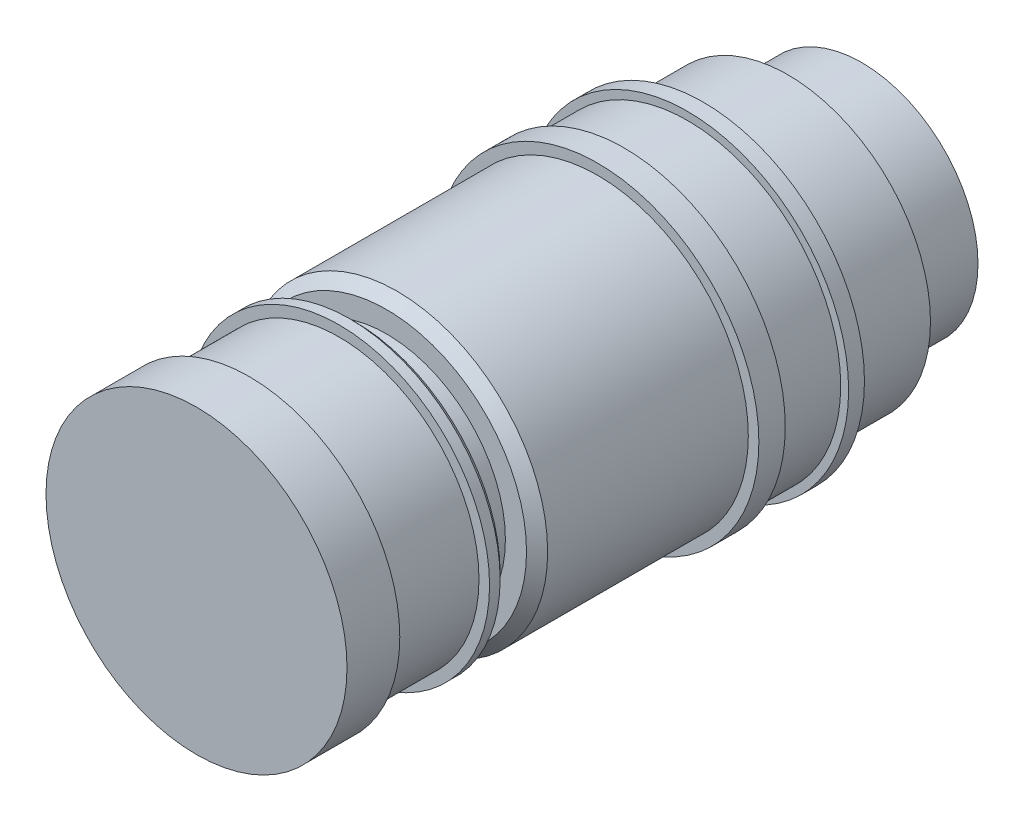
ISO-10303-21;
HEADER;
FILE_DESCRIPTION(('STEP AP214'),'2;1');
FILE_NAME('part.step','',(''),(''),'','','');
FILE_SCHEMA(('AUTOMOTIVE_DESIGN { 1 0 10303 214 1 1 1 1 }'));
ENDSEC;
DATA;
#1=APPLICATION_CONTEXT('core data for automotive mechanical design processes');
#2=APPLICATION_PROTOCOL_DEFINITION('international standard','automotive_design',2000,#1);
#3=PRODUCT_CONTEXT('',#1,'mechanical');
#4=PRODUCT('Part','Part','',(#3));
#5=PRODUCT_RELATED_PRODUCT_CATEGORY('part','',(#4));
#6=PRODUCT_DEFINITION_FORMATION('','',#4);
#7=PRODUCT_DEFINITION_CONTEXT('part definition',#1,'design');
#8=PRODUCT_DEFINITION('design','',#6,#7);
#9=PRODUCT_DEFINITION_SHAPE('','',#8);
#10=(LENGTH_UNIT() NAMED_UNIT(*) SI_UNIT(.MILLI.,.METRE.));
#11=(NAMED_UNIT(*) PLANE_ANGLE_UNIT() SI_UNIT($,.RADIAN.));
#12=(NAMED_UNIT(*) SI_UNIT($,.STERADIAN.) SOLID_ANGLE_UNIT());
#13=UNCERTAINTY_MEASURE_WITH_UNIT(LENGTH_MEASURE(1.E-05),#10,'distance_accuracy_value','');
#14=(GEOMETRIC_REPRESENTATION_CONTEXT(3) GLOBAL_UNCERTAINTY_ASSIGNED_CONTEXT((#13)) GLOBAL_UNIT_ASSIGNED_CONTEXT((#10,
#11,#12)) REPRESENTATION_CONTEXT('',''));
#15=CARTESIAN_POINT('',(0.,0.,0.));
#16=DIRECTION('',(0.,0.,1.));
#17=DIRECTION('',(1.,0.,0.));
#18=AXIS2_PLACEMENT_3D('',#15,#16,#17);
#19=CARTESIAN_POINT('',(0.,0.,-63.));
#20=DIRECTION('',(0.,0.,1.));
#21=DIRECTION('',(1.,0.,0.));
#22=AXIS2_PLACEMENT_3D('',#19,#20,#21);
#23=PLANE('',#22);
#24=CARTESIAN_POINT('',(0.,0.,-63.));
#25=DIRECTION('',(0.,0.,1.));
#26=DIRECTION('',(1.,0.,0.));
#27=AXIS2_PLACEMENT_3D('',#24,#25,#26);
#28=CIRCLE('',#27,11.);
#29=CARTESIAN_POINT('',(11.,0.,-63.));
#30=VERTEX_POINT('',#29);
#31=EDGE_CURVE('E55',#30,#30,#28,.T.);
#32=ORIENTED_EDGE('',*,*,#31,.F.);
#33=EDGE_LOOP('',(#32));
#34=FACE_BOUND('',#33,.T.);
#35=ADVANCED_FACE('F35',(#34),#23,.F.);
#36=CARTESIAN_POINT('',(0.,0.,-5.));
#37=DIRECTION('',(0.,0.,1.));
#38=DIRECTION('',(1.,0.,0.));
#39=AXIS2_PLACEMENT_3D('',#36,#37,#38);
#40=CYLINDRICAL_SURFACE('',#39,11.);
#41=ORIENTED_EDGE('',*,*,#31,.T.);
#42=EDGE_LOOP('',(#41));
#43=FACE_BOUND('',#42,.T.);
#44=CARTESIAN_POINT('',(0.,0.,-56.));
#45=DIRECTION('',(0.,0.,1.));
#46=DIRECTION('',(1.,0.,0.));
#47=AXIS2_PLACEMENT_3D('',#44,#45,#46);
#48=CIRCLE('',#47,11.);
#49=CARTESIAN_POINT('',(11.,0.,-56.));
#50=VERTEX_POINT('',#49);
#51=EDGE_CURVE('E58',#50,#50,#48,.T.);
#52=ORIENTED_EDGE('',*,*,#51,.F.);
#53=EDGE_LOOP('',(#52));
#54=FACE_BOUND('',#53,.T.);
#55=ADVANCED_FACE('F127',(#43,#54),#40,.T.);
#56=CARTESIAN_POINT('',(0.,0.,-56.));
#57=DIRECTION('',(0.,0.,1.));
#58=DIRECTION('',(1.,0.,0.));
#59=AXIS2_PLACEMENT_3D('',#56,#57,#58);
#60=PLANE('',#59);
#61=CARTESIAN_POINT('',(0.,0.,-56.));
#62=DIRECTION('',(0.,0.,1.));
#63=DIRECTION('',(1.,0.,0.));
#64=AXIS2_PLACEMENT_3D('',#61,#62,#63);
#65=CIRCLE('',#64,13.5);
#66=CARTESIAN_POINT('',(13.5,0.,-56.));
#67=VERTEX_POINT('',#66);
#68=EDGE_CURVE('E61',#67,#67,#65,.T.);
#69=ORIENTED_EDGE('',*,*,#68,.F.);
#70=EDGE_LOOP('',(#69));
#71=FACE_BOUND('',#70,.T.);
#72=ORIENTED_EDGE('',*,*,#51,.T.);
#73=EDGE_LOOP('',(#72));
#74=FACE_BOUND('',#73,.T.);
#75=ADVANCED_FACE('F133',(#71,#74),#60,.F.);
#76=CARTESIAN_POINT('',(0.,0.,-5.));
#77=DIRECTION('',(0.,0.,1.));
#78=DIRECTION('',(1.,0.,0.));
#79=AXIS2_PLACEMENT_3D('',#76,#77,#78);
#80=CYLINDRICAL_SURFACE('',#79,13.5);
#81=ORIENTED_EDGE('',*,*,#68,.T.);
#82=EDGE_LOOP('',(#81));
#83=FACE_BOUND('',#82,.T.);
#84=CARTESIAN_POINT('',(0.,0.,-48.));
#85=DIRECTION('',(0.,0.,1.));
#86=DIRECTION('',(1.,0.,0.));
#87=AXIS2_PLACEMENT_3D('',#84,#85,#86);
#88=CIRCLE('',#87,13.5);
#89=CARTESIAN_POINT('',(13.5,0.,-48.));
#90=VERTEX_POINT('',#89);
#91=EDGE_CURVE('E64',#90,#90,#88,.T.);
#92=ORIENTED_EDGE('',*,*,#91,.F.);
#93=EDGE_LOOP('',(#92));
#94=FACE_BOUND('',#93,.T.);
#95=ADVANCED_FACE('F202',(#83,#94),#80,.T.);
#96=CARTESIAN_POINT('',(0.,0.,-48.));
#97=DIRECTION('',(0.,0.,1.));
#98=DIRECTION('',(1.,0.,0.));
#99=AXIS2_PLACEMENT_3D('',#96,#97,#98);
#100=PLANE('',#99);
#101=CARTESIAN_POINT('',(0.,0.,-48.));
#102=DIRECTION('',(0.,0.,1.));
#103=DIRECTION('',(1.,0.,0.));
#104=AXIS2_PLACEMENT_3D('',#101,#102,#103);
#105=CIRCLE('',#104,15.25);
#106=CARTESIAN_POINT('',(15.25,0.,-48.));
#107=VERTEX_POINT('',#106);
#108=EDGE_CURVE('E67',#107,#107,#105,.T.);
#109=ORIENTED_EDGE('',*,*,#108,.F.);
#110=EDGE_LOOP('',(#109));
#111=FACE_BOUND('',#110,.T.);
#112=ORIENTED_EDGE('',*,*,#91,.T.);
#113=EDGE_LOOP('',(#112));
#114=FACE_BOUND('',#113,.T.);
#115=ADVANCED_FACE('F198',(#111,#114),#100,.F.);
#116=CARTESIAN_POINT('',(0.,0.,-5.));
#117=DIRECTION('',(0.,0.,1.));
#118=DIRECTION('',(1.,0.,0.));
#119=AXIS2_PLACEMENT_3D('',#116,#117,#118);
#120=CYLINDRICAL_SURFACE('',#119,15.25);
#121=ORIENTED_EDGE('',*,*,#108,.T.);
#122=EDGE_LOOP('',(#121));
#123=FACE_BOUND('',#122,.T.);
#124=CARTESIAN_POINT('',(0.,0.,-46.5));
#125=DIRECTION('',(0.,0.,1.));
#126=DIRECTION('',(1.,0.,0.));
#127=AXIS2_PLACEMENT_3D('',#124,#125,#126);
#128=CIRCLE('',#127,15.25);
#129=CARTESIAN_POINT('',(15.25,0.,-46.5));
#130=VERTEX_POINT('',#129);
#131=EDGE_CURVE('E70',#130,#130,#128,.T.);
#132=ORIENTED_EDGE('',*,*,#131,.F.);
#133=EDGE_LOOP('',(#132));
#134=FACE_BOUND('',#133,.T.);
#135=ADVANCED_FACE('F194',(#123,#134),#120,.T.);
#136=CARTESIAN_POINT('',(0.,0.,-46.5));
#137=DIRECTION('',(0.,0.,1.));
#138=DIRECTION('',(1.,0.,0.));
#139=AXIS2_PLACEMENT_3D('',#136,#137,#138);
#140=PLANE('',#139);
#141=ORIENTED_EDGE('',*,*,#131,.T.);
#142=EDGE_LOOP('',(#141));
#143=FACE_BOUND('',#142,.T.);
#144=CARTESIAN_POINT('',(0.,0.,-46.5));
#145=DIRECTION('',(0.,0.,1.));
#146=DIRECTION('',(1.,0.,0.));
#147=AXIS2_PLACEMENT_3D('',#144,#145,#146);
#148=CIRCLE('',#147,14.5);
#149=CARTESIAN_POINT('',(14.5,0.,-46.5));
#150=VERTEX_POINT('',#149);
#151=EDGE_CURVE('E73',#150,#150,#148,.T.);
#152=ORIENTED_EDGE('',*,*,#151,.F.);
#153=EDGE_LOOP('',(#152));
#154=FACE_BOUND('',#153,.T.);
#155=ADVANCED_FACE('F190',(#143,#154),#140,.T.);
#156=CARTESIAN_POINT('',(0.,0.,-5.));
#157=DIRECTION('',(0.,0.,1.));
#158=DIRECTION('',(1.,0.,0.));
#159=AXIS2_PLACEMENT_3D('',#156,#157,#158);
#160=CYLINDRICAL_SURFACE('',#159,14.5);
#161=ORIENTED_EDGE('',*,*,#151,.T.);
#162=EDGE_LOOP('',(#161));
#163=FACE_BOUND('',#162,.T.);
#164=CARTESIAN_POINT('',(0.,0.,-40.5));
#165=DIRECTION('',(0.,0.,1.));
#166=DIRECTION('',(1.,0.,0.));
#167=AXIS2_PLACEMENT_3D('',#164,#165,#166);
#168=CIRCLE('',#167,14.5);
#169=CARTESIAN_POINT('',(14.5,0.,-40.5));
#170=VERTEX_POINT('',#169);
#171=EDGE_CURVE('E76',#170,#170,#168,.T.);
#172=ORIENTED_EDGE('',*,*,#171,.F.);
#173=EDGE_LOOP('',(#172));
#174=FACE_BOUND('',#173,.T.);
#175=ADVANCED_FACE('F186',(#163,#174),#160,.T.);
#176=CARTESIAN_POINT('',(0.,0.,-40.5));
#177=DIRECTION('',(0.,0.,1.));
#178=DIRECTION('',(1.,0.,0.));
#179=AXIS2_PLACEMENT_3D('',#176,#177,#178);
#180=PLANE('',#179);
#181=CARTESIAN_POINT('',(0.,0.,-40.5));
#182=DIRECTION('',(0.,0.,1.));
#183=DIRECTION('',(1.,0.,0.));
#184=AXIS2_PLACEMENT_3D('',#181,#182,#183);
#185=CIRCLE('',#184,15.25);
#186=CARTESIAN_POINT('',(15.25,0.,-40.5));
#187=VERTEX_POINT('',#186);
#188=EDGE_CURVE('E79',#187,#187,#185,.T.);
#189=ORIENTED_EDGE('',*,*,#188,.F.);
#190=EDGE_LOOP('',(#189));
#191=FACE_BOUND('',#190,.T.);
#192=ORIENTED_EDGE('',*,*,#171,.T.);
#193=EDGE_LOOP('',(#192));
#194=FACE_BOUND('',#193,.T.);
#195=ADVANCED_FACE('F182',(#191,#194),#180,.F.);
#196=CARTESIAN_POINT('',(0.,0.,-5.));
#197=DIRECTION('',(0.,0.,1.));
#198=DIRECTION('',(1.,0.,0.));
#199=AXIS2_PLACEMENT_3D('',#196,#197,#198);
#200=CYLINDRICAL_SURFACE('',#199,15.25);
#201=ORIENTED_EDGE('',*,*,#188,.T.);
#202=EDGE_LOOP('',(#201));
#203=FACE_BOUND('',#202,.T.);
#204=CARTESIAN_POINT('',(0.,0.,-38.));
#205=DIRECTION('',(0.,0.,1.));
#206=DIRECTION('',(1.,0.,0.));
#207=AXIS2_PLACEMENT_3D('',#204,#205,#206);
#208=CIRCLE('',#207,15.25);
#209=CARTESIAN_POINT('',(15.25,0.,-38.));
#210=VERTEX_POINT('',#209);
#211=EDGE_CURVE('E82',#210,#210,#208,.T.);
#212=ORIENTED_EDGE('',*,*,#211,.F.);
#213=EDGE_LOOP('',(#212));
#214=FACE_BOUND('',#213,.T.);
#215=ADVANCED_FACE('F178',(#203,#214),#200,.T.);
#216=CARTESIAN_POINT('',(0.,0.,-38.));
#217=DIRECTION('',(0.,0.,1.));
#218=DIRECTION('',(1.,0.,0.));
#219=AXIS2_PLACEMENT_3D('',#216,#217,#218);
#220=PLANE('',#219);
#221=ORIENTED_EDGE('',*,*,#211,.T.);
#222=EDGE_LOOP('',(#221));
#223=FACE_BOUND('',#222,.T.);
#224=CARTESIAN_POINT('',(0.,0.,-38.));
#225=DIRECTION('',(0.,0.,1.));
#226=DIRECTION('',(1.,0.,0.));
#227=AXIS2_PLACEMENT_3D('',#224,#225,#226);
#228=CIRCLE('',#227,14.25);
#229=CARTESIAN_POINT('',(14.25,0.,-38.));
#230=VERTEX_POINT('',#229);
#231=EDGE_CURVE('E85',#230,#230,#228,.T.);
#232=ORIENTED_EDGE('',*,*,#231,.F.);
#233=EDGE_LOOP('',(#232));
#234=FACE_BOUND('',#233,.T.);
#235=ADVANCED_FACE('F174',(#223,#234),#220,.T.);
#236=CARTESIAN_POINT('',(0.,0.,-5.));
#237=DIRECTION('',(0.,0.,1.));
#238=DIRECTION('',(1.,0.,0.));
#239=AXIS2_PLACEMENT_3D('',#236,#237,#238);
#240=CYLINDRICAL_SURFACE('',#239,14.25);
#241=CARTESIAN_POINT('',(0.,0.,-19.));
#242=DIRECTION('',(0.,0.,1.));
#243=DIRECTION('',(1.,0.,0.));
#244=AXIS2_PLACEMENT_3D('',#241,#242,#243);
#245=CIRCLE('',#244,14.25);
#246=CARTESIAN_POINT('',(14.25,0.,-19.));
#247=VERTEX_POINT('',#246);
#248=EDGE_CURVE('E46',#247,#247,#245,.F.);
#249=ORIENTED_EDGE('',*,*,#248,.T.);
#250=EDGE_LOOP('',(#249));
#251=FACE_BOUND('',#250,.T.);
#252=ORIENTED_EDGE('',*,*,#231,.T.);
#253=EDGE_LOOP('',(#252));
#254=FACE_BOUND('',#253,.T.);
#255=ADVANCED_FACE('F152',(#251,#254),#240,.T.);
#256=CARTESIAN_POINT('',(0.,0.,-18.));
#257=DIRECTION('',(0.,0.,1.));
#258=DIRECTION('',(1.,0.,0.));
#259=AXIS2_PLACEMENT_3D('',#256,#257,#258);
#260=PLANE('',#259);
#261=CARTESIAN_POINT('',(0.,0.,-18.));
#262=DIRECTION('',(0.,0.,1.));
#263=DIRECTION('',(1.,0.,0.));
#264=AXIS2_PLACEMENT_3D('',#261,#262,#263);
#265=CIRCLE('',#264,13.25);
#266=CARTESIAN_POINT('',(13.25,0.,-18.));
#267=VERTEX_POINT('',#266);
#268=EDGE_CURVE('E50',#267,#267,#265,.T.);
#269=ORIENTED_EDGE('',*,*,#268,.T.);
#270=EDGE_LOOP('',(#269));
#271=FACE_BOUND('',#270,.T.);
#272=CARTESIAN_POINT('',(0.,0.,-18.));
#273=DIRECTION('',(0.,0.,1.));
#274=DIRECTION('',(1.,0.,0.));
#275=AXIS2_PLACEMENT_3D('',#272,#273,#274);
#276=CIRCLE('',#275,11.25);
#277=CARTESIAN_POINT('',(11.25,0.,-18.));
#278=VERTEX_POINT('',#277);
#279=EDGE_CURVE('E88',#278,#278,#276,.T.);
#280=ORIENTED_EDGE('',*,*,#279,.F.);
#281=EDGE_LOOP('',(#280));
#282=FACE_BOUND('',#281,.T.);
#283=ADVANCED_FACE('F148',(#271,#282),#260,.T.);
#284=CARTESIAN_POINT('',(0.,0.,-5.));
#285=DIRECTION('',(0.,0.,1.));
#286=DIRECTION('',(1.,0.,0.));
#287=AXIS2_PLACEMENT_3D('',#284,#285,#286);
#288=CYLINDRICAL_SURFACE('',#287,11.25);
#289=ORIENTED_EDGE('',*,*,#279,.T.);
#290=EDGE_LOOP('',(#289));
#291=FACE_BOUND('',#290,.T.);
#292=CARTESIAN_POINT('',(0.,0.,-15.));
#293=DIRECTION('',(0.,0.,1.));
#294=DIRECTION('',(1.,0.,0.));
#295=AXIS2_PLACEMENT_3D('',#292,#293,#294);
#296=CIRCLE('',#295,11.25);
#297=CARTESIAN_POINT('',(11.25,0.,-15.));
#298=VERTEX_POINT('',#297);
#299=EDGE_CURVE('E91',#298,#298,#296,.T.);
#300=ORIENTED_EDGE('',*,*,#299,.F.);
#301=EDGE_LOOP('',(#300));
#302=FACE_BOUND('',#301,.T.);
#303=ADVANCED_FACE('F151',(#291,#302),#288,.T.);
#304=CARTESIAN_POINT('',(0.,0.,-15.));
#305=DIRECTION('',(0.,0.,1.));
#306=DIRECTION('',(1.,0.,0.));
#307=AXIS2_PLACEMENT_3D('',#304,#305,#306);
#308=PLANE('',#307);
#309=CARTESIAN_POINT('',(0.,0.,-15.));
#310=DIRECTION('',(0.,0.,1.));
#311=DIRECTION('',(1.,0.,0.));
#312=AXIS2_PLACEMENT_3D('',#309,#310,#311);
#313=CIRCLE('',#312,13.75);
#314=CARTESIAN_POINT('',(13.75,0.,-15.));
#315=VERTEX_POINT('',#314);
#316=EDGE_CURVE('E10',#315,#315,#313,.F.);
#317=ORIENTED_EDGE('',*,*,#316,.T.);
#318=EDGE_LOOP('',(#317));
#319=FACE_BOUND('',#318,.T.);
#320=ORIENTED_EDGE('',*,*,#299,.T.);
#321=EDGE_LOOP('',(#320));
#322=FACE_BOUND('',#321,.T.);
#323=ADVANCED_FACE('F158',(#319,#322),#308,.F.);
#324=CARTESIAN_POINT('',(0.,0.,-5.));
#325=DIRECTION('',(0.,0.,1.));
#326=DIRECTION('',(1.,0.,0.));
#327=AXIS2_PLACEMENT_3D('',#324,#325,#326);
#328=CYLINDRICAL_SURFACE('',#327,14.25);
#329=CARTESIAN_POINT('',(0.,0.,-14.5));
#330=DIRECTION('',(0.,0.,1.));
#331=DIRECTION('',(1.,0.,0.));
#332=AXIS2_PLACEMENT_3D('',#329,#330,#331);
#333=CIRCLE('',#332,14.25);
#334=CARTESIAN_POINT('',(14.25,0.,-14.5));
#335=VERTEX_POINT('',#334);
#336=EDGE_CURVE('E42',#335,#335,#333,.T.);
#337=ORIENTED_EDGE('',*,*,#336,.T.);
#338=EDGE_LOOP('',(#337));
#339=FACE_BOUND('',#338,.T.);
#340=CARTESIAN_POINT('',(0.,0.,-13.5));
#341=DIRECTION('',(0.,0.,1.));
#342=DIRECTION('',(1.,0.,0.));
#343=AXIS2_PLACEMENT_3D('',#340,#341,#342);
#344=CIRCLE('',#343,14.25);
#345=CARTESIAN_POINT('',(14.25,0.,-13.5));
#346=VERTEX_POINT('',#345);
#347=EDGE_CURVE('E94',#346,#346,#344,.T.);
#348=ORIENTED_EDGE('',*,*,#347,.F.);
#349=EDGE_LOOP('',(#348));
#350=FACE_BOUND('',#349,.T.);
#351=ADVANCED_FACE('F163',(#339,#350),#328,.T.);
#352=CARTESIAN_POINT('',(0.,0.,-13.5));
#353=DIRECTION('',(0.,0.,1.));
#354=DIRECTION('',(1.,0.,0.));
#355=AXIS2_PLACEMENT_3D('',#352,#353,#354);
#356=PLANE('',#355);
#357=ORIENTED_EDGE('',*,*,#347,.T.);
#358=EDGE_LOOP('',(#357));
#359=FACE_BOUND('',#358,.T.);
#360=CARTESIAN_POINT('',(0.,0.,-13.5));
#361=DIRECTION('',(0.,0.,1.));
#362=DIRECTION('',(1.,0.,0.));
#363=AXIS2_PLACEMENT_3D('',#360,#361,#362);
#364=CIRCLE('',#363,13.25);
#365=CARTESIAN_POINT('',(13.25,0.,-13.5));
#366=VERTEX_POINT('',#365);
#367=EDGE_CURVE('E97',#366,#366,#364,.T.);
#368=ORIENTED_EDGE('',*,*,#367,.F.);
#369=EDGE_LOOP('',(#368));
#370=FACE_BOUND('',#369,.T.);
#371=ADVANCED_FACE('F168',(#359,#370),#356,.T.);
#372=CARTESIAN_POINT('',(0.,0.,-5.));
#373=DIRECTION('',(0.,0.,1.));
#374=DIRECTION('',(1.,0.,0.));
#375=AXIS2_PLACEMENT_3D('',#372,#373,#374);
#376=CYLINDRICAL_SURFACE('',#375,13.25);
#377=ORIENTED_EDGE('',*,*,#367,.T.);
#378=EDGE_LOOP('',(#377));
#379=FACE_BOUND('',#378,.T.);
#380=CARTESIAN_POINT('',(0.,0.,-5.));
#381=DIRECTION('',(0.,0.,1.));
#382=DIRECTION('',(1.,0.,0.));
#383=AXIS2_PLACEMENT_3D('',#380,#381,#382);
#384=CIRCLE('',#383,13.25);
#385=CARTESIAN_POINT('',(13.25,0.,-5.));
#386=VERTEX_POINT('',#385);
#387=EDGE_CURVE('E100',#386,#386,#384,.T.);
#388=ORIENTED_EDGE('',*,*,#387,.F.);
#389=EDGE_LOOP('',(#388));
#390=FACE_BOUND('',#389,.T.);
#391=ADVANCED_FACE('F123',(#379,#390),#376,.T.);
#392=CARTESIAN_POINT('',(0.,0.,-5.));
#393=DIRECTION('',(0.,0.,1.));
#394=DIRECTION('',(1.,0.,0.));
#395=AXIS2_PLACEMENT_3D('',#392,#393,#394);
#396=PLANE('',#395);
#397=CARTESIAN_POINT('',(0.,0.,-5.));
#398=DIRECTION('',(0.,0.,1.));
#399=DIRECTION('',(1.,0.,0.));
#400=AXIS2_PLACEMENT_3D('',#397,#398,#399);
#401=CIRCLE('',#400,14.25);
#402=CARTESIAN_POINT('',(14.25,0.,-5.));
#403=VERTEX_POINT('',#402);
#404=EDGE_CURVE('E103',#403,#403,#401,.T.);
#405=ORIENTED_EDGE('',*,*,#404,.F.);
#406=EDGE_LOOP('',(#405));
#407=FACE_BOUND('',#406,.T.);
#408=ORIENTED_EDGE('',*,*,#387,.T.);
#409=EDGE_LOOP('',(#408));
#410=FACE_BOUND('',#409,.T.);
#411=ADVANCED_FACE('F114',(#407,#410),#396,.F.);
#412=CARTESIAN_POINT('',(0.,0.,-5.));
#413=DIRECTION('',(0.,0.,1.));
#414=DIRECTION('',(1.,0.,0.));
#415=AXIS2_PLACEMENT_3D('',#412,#413,#414);
#416=CYLINDRICAL_SURFACE('',#415,14.25);
#417=ORIENTED_EDGE('',*,*,#404,.T.);
#418=EDGE_LOOP('',(#417));
#419=FACE_BOUND('',#418,.T.);
#420=CARTESIAN_POINT('',(0.,0.,0.));
#421=DIRECTION('',(0.,0.,1.));
#422=DIRECTION('',(1.,0.,0.));
#423=AXIS2_PLACEMENT_3D('',#420,#421,#422);
#424=CIRCLE('',#423,14.25);
#425=CARTESIAN_POINT('',(14.25,0.,0.));
#426=VERTEX_POINT('',#425);
#427=EDGE_CURVE('E106',#426,#426,#424,.T.);
#428=ORIENTED_EDGE('',*,*,#427,.F.);
#429=EDGE_LOOP('',(#428));
#430=FACE_BOUND('',#429,.T.);
#431=ADVANCED_FACE('F112',(#419,#430),#416,.T.);
#432=CARTESIAN_POINT('',(0.,0.,0.));
#433=DIRECTION('',(0.,0.,1.));
#434=DIRECTION('',(1.,0.,0.));
#435=AXIS2_PLACEMENT_3D('',#432,#433,#434);
#436=PLANE('',#435);
#437=ORIENTED_EDGE('',*,*,#427,.T.);
#438=EDGE_LOOP('',(#437));
#439=FACE_BOUND('',#438,.T.);
#440=ADVANCED_FACE('F110',(#439),#436,.T.);
#441=CARTESIAN_POINT('',(0.,0.,-18.));
#442=DIRECTION('',(0.,0.,-1.));
#443=DIRECTION('',(-1.,0.,0.));
#444=AXIS2_PLACEMENT_3D('',#441,#442,#443);
#445=CONICAL_SURFACE('',#444,13.25,0.785398163397451);
#446=ORIENTED_EDGE('',*,*,#248,.F.);
#447=EDGE_LOOP('',(#446));
#448=FACE_BOUND('',#447,.T.);
#449=ORIENTED_EDGE('',*,*,#268,.F.);
#450=EDGE_LOOP('',(#449));
#451=FACE_BOUND('',#450,.T.);
#452=ADVANCED_FACE('F121',(#448,#451),#445,.T.);
#453=CARTESIAN_POINT('',(0.,0.,-14.5));
#454=DIRECTION('',(0.,0.,1.));
#455=DIRECTION('',(1.,0.,0.));
#456=AXIS2_PLACEMENT_3D('',#453,#454,#455);
#457=CONICAL_SURFACE('',#456,14.25,0.785398163397448);
#458=ORIENTED_EDGE('',*,*,#316,.F.);
#459=EDGE_LOOP('',(#458));
#460=FACE_BOUND('',#459,.T.);
#461=ORIENTED_EDGE('',*,*,#336,.F.);
#462=EDGE_LOOP('',(#461));
#463=FACE_BOUND('',#462,.T.);
#464=ADVANCED_FACE('F37',(#460,#463),#457,.T.);
#465=CLOSED_SHELL('',(#35,#55,#75,#95,#115,#135,#155,#175,#195,#215,#235,#255,#283,#303,#323,
#351,#371,#391,#411,#431,#440,#452,#464));
#466=MANIFOLD_SOLID_BREP('B2',#465);
#467=ADVANCED_BREP_SHAPE_REPRESENTATION('',(#18,#466),#14);
#468=SHAPE_DEFINITION_REPRESENTATION(#9,#467);
ENDSEC;
END-ISO-10303-21;
